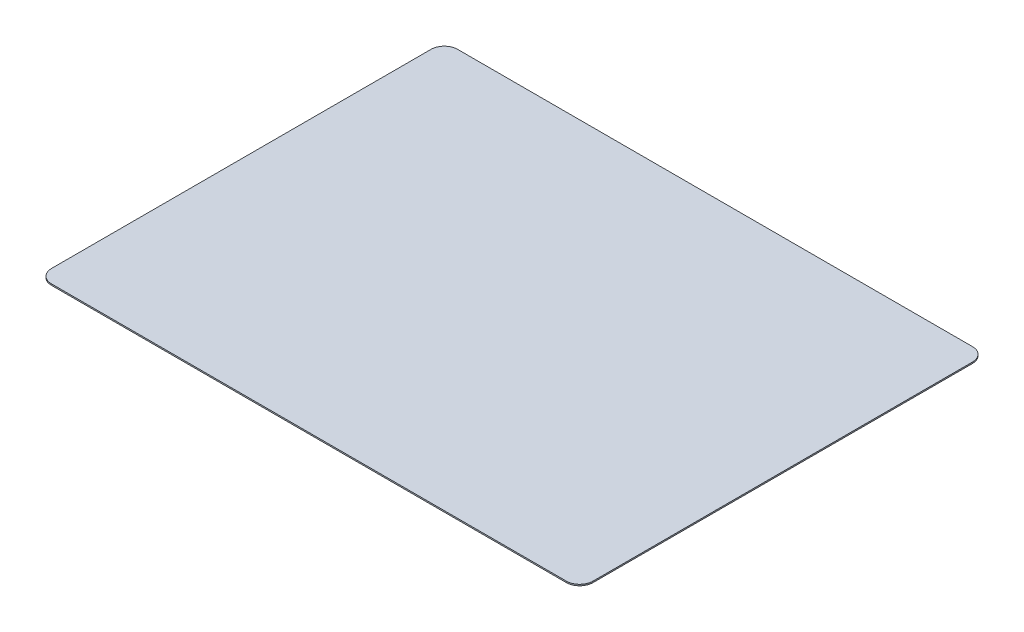
ISO-10303-21;
HEADER;
FILE_DESCRIPTION(('STEP AP214'),'2;1');
FILE_NAME('part.step','',(''),(''),'','','');
FILE_SCHEMA(('AUTOMOTIVE_DESIGN { 1 0 10303 214 1 1 1 1 }'));
ENDSEC;
DATA;
#1=APPLICATION_CONTEXT('core data for automotive mechanical design processes');
#2=APPLICATION_PROTOCOL_DEFINITION('international standard','automotive_design',2000,#1);
#3=PRODUCT_CONTEXT('',#1,'mechanical');
#4=PRODUCT('Part','Part','',(#3));
#5=PRODUCT_RELATED_PRODUCT_CATEGORY('part','',(#4));
#6=PRODUCT_DEFINITION_FORMATION('','',#4);
#7=PRODUCT_DEFINITION_CONTEXT('part definition',#1,'design');
#8=PRODUCT_DEFINITION('design','',#6,#7);
#9=PRODUCT_DEFINITION_SHAPE('','',#8);
#10=(LENGTH_UNIT() NAMED_UNIT(*) SI_UNIT(.MILLI.,.METRE.));
#11=(NAMED_UNIT(*) PLANE_ANGLE_UNIT() SI_UNIT($,.RADIAN.));
#12=(NAMED_UNIT(*) SI_UNIT($,.STERADIAN.) SOLID_ANGLE_UNIT());
#13=UNCERTAINTY_MEASURE_WITH_UNIT(LENGTH_MEASURE(1.E-05),#10,'distance_accuracy_value','');
#14=(GEOMETRIC_REPRESENTATION_CONTEXT(3) GLOBAL_UNCERTAINTY_ASSIGNED_CONTEXT((#13)) GLOBAL_UNIT_ASSIGNED_CONTEXT((#10,
#11,#12)) REPRESENTATION_CONTEXT('',''));
#15=CARTESIAN_POINT('',(0.,0.,0.));
#16=DIRECTION('',(0.,0.,1.));
#17=DIRECTION('',(1.,0.,0.));
#18=AXIS2_PLACEMENT_3D('',#15,#16,#17);
#19=CARTESIAN_POINT('',(203.2,1.,-152.4));
#20=DIRECTION('',(-1.,0.,0.));
#21=DIRECTION('',(0.,0.,1.));
#22=AXIS2_PLACEMENT_3D('',#19,#20,#21);
#23=PLANE('',#22);
#24=DIRECTION('',(0.,0.,-1.));
#25=VECTOR('',#24,1.);
#26=CARTESIAN_POINT('',(203.2,0.,-152.4));
#27=LINE('',#26,#25);
#28=CARTESIAN_POINT('',(203.2,0.,142.4));
#29=VERTEX_POINT('',#28);
#30=CARTESIAN_POINT('',(203.2,0.,-142.4));
#31=VERTEX_POINT('',#30);
#32=EDGE_CURVE('E140',#29,#31,#27,.T.);
#33=ORIENTED_EDGE('',*,*,#32,.T.);
#34=DIRECTION('',(0.,-1.,0.));
#35=VECTOR('',#34,1.);
#36=CARTESIAN_POINT('',(203.2,1.,-142.4));
#37=LINE('',#36,#35);
#38=CARTESIAN_POINT('',(203.2,1.,-142.4));
#39=VERTEX_POINT('',#38);
#40=EDGE_CURVE('E115',#31,#39,#37,.F.);
#41=ORIENTED_EDGE('',*,*,#40,.T.);
#42=DIRECTION('',(0.,0.,-1.));
#43=VECTOR('',#42,1.);
#44=CARTESIAN_POINT('',(203.2,1.,-152.4));
#45=LINE('',#44,#43);
#46=CARTESIAN_POINT('',(203.2,1.,142.4));
#47=VERTEX_POINT('',#46);
#48=EDGE_CURVE('E152',#47,#39,#45,.T.);
#49=ORIENTED_EDGE('',*,*,#48,.F.);
#50=DIRECTION('',(0.,-1.,0.));
#51=VECTOR('',#50,1.);
#52=CARTESIAN_POINT('',(203.2,1.,142.4));
#53=LINE('',#52,#51);
#54=EDGE_CURVE('E121',#47,#29,#53,.T.);
#55=ORIENTED_EDGE('',*,*,#54,.T.);
#56=EDGE_LOOP('',(#33,#41,#49,#55));
#57=FACE_BOUND('',#56,.T.);
#58=ADVANCED_FACE('F43',(#57),#23,.F.);
#59=CARTESIAN_POINT('',(-203.2,1.,-152.4));
#60=DIRECTION('',(0.,0.,1.));
#61=DIRECTION('',(1.,0.,0.));
#62=AXIS2_PLACEMENT_3D('',#59,#60,#61);
#63=PLANE('',#62);
#64=DIRECTION('',(-1.,0.,0.));
#65=VECTOR('',#64,1.);
#66=CARTESIAN_POINT('',(-203.2,1.,-152.4));
#67=LINE('',#66,#65);
#68=CARTESIAN_POINT('',(193.2,1.,-152.4));
#69=VERTEX_POINT('',#68);
#70=CARTESIAN_POINT('',(-193.2,1.,-152.4));
#71=VERTEX_POINT('',#70);
#72=EDGE_CURVE('E131',#69,#71,#67,.T.);
#73=ORIENTED_EDGE('',*,*,#72,.F.);
#74=DIRECTION('',(0.,-1.,0.));
#75=VECTOR('',#74,1.);
#76=CARTESIAN_POINT('',(193.2,1.,-152.4));
#77=LINE('',#76,#75);
#78=CARTESIAN_POINT('',(193.2,0.,-152.4));
#79=VERTEX_POINT('',#78);
#80=EDGE_CURVE('E114',#69,#79,#77,.T.);
#81=ORIENTED_EDGE('',*,*,#80,.T.);
#82=DIRECTION('',(-1.,0.,0.));
#83=VECTOR('',#82,1.);
#84=CARTESIAN_POINT('',(-203.2,0.,-152.4));
#85=LINE('',#84,#83);
#86=CARTESIAN_POINT('',(-193.2,0.,-152.4));
#87=VERTEX_POINT('',#86);
#88=EDGE_CURVE('E128',#79,#87,#85,.T.);
#89=ORIENTED_EDGE('',*,*,#88,.T.);
#90=DIRECTION('',(0.,-1.,0.));
#91=VECTOR('',#90,1.);
#92=CARTESIAN_POINT('',(-193.2,1.,-152.4));
#93=LINE('',#92,#91);
#94=EDGE_CURVE('E134',#87,#71,#93,.F.);
#95=ORIENTED_EDGE('',*,*,#94,.T.);
#96=EDGE_LOOP('',(#73,#81,#89,#95));
#97=FACE_BOUND('',#96,.T.);
#98=ADVANCED_FACE('F127',(#97),#63,.F.);
#99=CARTESIAN_POINT('',(-203.2,1.,-152.4));
#100=DIRECTION('',(1.,0.,0.));
#101=DIRECTION('',(0.,0.,-1.));
#102=AXIS2_PLACEMENT_3D('',#99,#100,#101);
#103=PLANE('',#102);
#104=DIRECTION('',(0.,0.,1.));
#105=VECTOR('',#104,1.);
#106=CARTESIAN_POINT('',(-203.2,1.,-152.4));
#107=LINE('',#106,#105);
#108=CARTESIAN_POINT('',(-203.2,1.,-142.4));
#109=VERTEX_POINT('',#108);
#110=CARTESIAN_POINT('',(-203.2,1.,142.4));
#111=VERTEX_POINT('',#110);
#112=EDGE_CURVE('E188',#109,#111,#107,.T.);
#113=ORIENTED_EDGE('',*,*,#112,.F.);
#114=DIRECTION('',(0.,-1.,0.));
#115=VECTOR('',#114,1.);
#116=CARTESIAN_POINT('',(-203.2,1.,-142.4));
#117=LINE('',#116,#115);
#118=CARTESIAN_POINT('',(-203.2,0.,-142.4));
#119=VERTEX_POINT('',#118);
#120=EDGE_CURVE('E182',#109,#119,#117,.T.);
#121=ORIENTED_EDGE('',*,*,#120,.T.);
#122=DIRECTION('',(0.,0.,1.));
#123=VECTOR('',#122,1.);
#124=CARTESIAN_POINT('',(-203.2,0.,-152.4));
#125=LINE('',#124,#123);
#126=CARTESIAN_POINT('',(-203.2,0.,142.4));
#127=VERTEX_POINT('',#126);
#128=EDGE_CURVE('E139',#119,#127,#125,.T.);
#129=ORIENTED_EDGE('',*,*,#128,.T.);
#130=DIRECTION('',(0.,-1.,0.));
#131=VECTOR('',#130,1.);
#132=CARTESIAN_POINT('',(-203.2,1.,142.4));
#133=LINE('',#132,#131);
#134=EDGE_CURVE('E179',#127,#111,#133,.F.);
#135=ORIENTED_EDGE('',*,*,#134,.T.);
#136=EDGE_LOOP('',(#113,#121,#129,#135));
#137=FACE_BOUND('',#136,.T.);
#138=ADVANCED_FACE('F209',(#137),#103,.F.);
#139=CARTESIAN_POINT('',(-203.2,1.,152.4));
#140=DIRECTION('',(0.,0.,-1.));
#141=DIRECTION('',(-1.,0.,0.));
#142=AXIS2_PLACEMENT_3D('',#139,#140,#141);
#143=PLANE('',#142);
#144=DIRECTION('',(1.,0.,0.));
#145=VECTOR('',#144,1.);
#146=CARTESIAN_POINT('',(-203.2,1.,152.4));
#147=LINE('',#146,#145);
#148=CARTESIAN_POINT('',(-193.2,1.,152.4));
#149=VERTEX_POINT('',#148);
#150=CARTESIAN_POINT('',(193.2,1.,152.4));
#151=VERTEX_POINT('',#150);
#152=EDGE_CURVE('E154',#149,#151,#147,.T.);
#153=ORIENTED_EDGE('',*,*,#152,.F.);
#154=DIRECTION('',(0.,-1.,0.));
#155=VECTOR('',#154,1.);
#156=CARTESIAN_POINT('',(-193.2,1.,152.4));
#157=LINE('',#156,#155);
#158=CARTESIAN_POINT('',(-193.2,0.,152.4));
#159=VERTEX_POINT('',#158);
#160=EDGE_CURVE('E11',#149,#159,#157,.T.);
#161=ORIENTED_EDGE('',*,*,#160,.T.);
#162=DIRECTION('',(1.,0.,0.));
#163=VECTOR('',#162,1.);
#164=CARTESIAN_POINT('',(-203.2,0.,152.4));
#165=LINE('',#164,#163);
#166=CARTESIAN_POINT('',(193.2,0.,152.4));
#167=VERTEX_POINT('',#166);
#168=EDGE_CURVE('E145',#159,#167,#165,.T.);
#169=ORIENTED_EDGE('',*,*,#168,.T.);
#170=DIRECTION('',(0.,-1.,0.));
#171=VECTOR('',#170,1.);
#172=CARTESIAN_POINT('',(193.2,1.,152.4));
#173=LINE('',#172,#171);
#174=EDGE_CURVE('E52',#167,#151,#173,.F.);
#175=ORIENTED_EDGE('',*,*,#174,.T.);
#176=EDGE_LOOP('',(#153,#161,#169,#175));
#177=FACE_BOUND('',#176,.T.);
#178=ADVANCED_FACE('F202',(#177),#143,.F.);
#179=CARTESIAN_POINT('',(0.,1.,0.));
#180=DIRECTION('',(0.,1.,0.));
#181=DIRECTION('',(0.,0.,1.));
#182=AXIS2_PLACEMENT_3D('',#179,#180,#181);
#183=PLANE('',#182);
#184=ORIENTED_EDGE('',*,*,#48,.T.);
#185=CARTESIAN_POINT('',(193.2,1.,-142.4));
#186=DIRECTION('',(0.,1.,0.));
#187=DIRECTION('',(0.,0.,1.));
#188=AXIS2_PLACEMENT_3D('',#185,#186,#187);
#189=CIRCLE('',#188,10.);
#190=EDGE_CURVE('E176',#39,#69,#189,.T.);
#191=ORIENTED_EDGE('',*,*,#190,.T.);
#192=ORIENTED_EDGE('',*,*,#72,.T.);
#193=CARTESIAN_POINT('',(-193.2,1.,-142.4));
#194=DIRECTION('',(0.,1.,0.));
#195=DIRECTION('',(0.,0.,1.));
#196=AXIS2_PLACEMENT_3D('',#193,#194,#195);
#197=CIRCLE('',#196,10.);
#198=EDGE_CURVE('E173',#71,#109,#197,.T.);
#199=ORIENTED_EDGE('',*,*,#198,.T.);
#200=ORIENTED_EDGE('',*,*,#112,.T.);
#201=CARTESIAN_POINT('',(-193.2,1.,142.4));
#202=DIRECTION('',(0.,1.,0.));
#203=DIRECTION('',(0.,0.,1.));
#204=AXIS2_PLACEMENT_3D('',#201,#202,#203);
#205=CIRCLE('',#204,10.);
#206=EDGE_CURVE('E65',#111,#149,#205,.T.);
#207=ORIENTED_EDGE('',*,*,#206,.T.);
#208=ORIENTED_EDGE('',*,*,#152,.T.);
#209=CARTESIAN_POINT('',(193.2,1.,142.4));
#210=DIRECTION('',(0.,1.,0.));
#211=DIRECTION('',(0.,0.,1.));
#212=AXIS2_PLACEMENT_3D('',#209,#210,#211);
#213=CIRCLE('',#212,10.);
#214=EDGE_CURVE('E168',#151,#47,#213,.T.);
#215=ORIENTED_EDGE('',*,*,#214,.T.);
#216=EDGE_LOOP('',(#184,#191,#192,#199,#200,#207,#208,#215));
#217=FACE_BOUND('',#216,.T.);
#218=ADVANCED_FACE('F196',(#217),#183,.T.);
#219=CARTESIAN_POINT('',(0.,0.,0.));
#220=DIRECTION('',(0.,1.,0.));
#221=DIRECTION('',(0.,0.,1.));
#222=AXIS2_PLACEMENT_3D('',#219,#220,#221);
#223=PLANE('',#222);
#224=ORIENTED_EDGE('',*,*,#88,.F.);
#225=CARTESIAN_POINT('',(193.2,0.,-142.4));
#226=DIRECTION('',(0.,1.,0.));
#227=DIRECTION('',(0.,0.,1.));
#228=AXIS2_PLACEMENT_3D('',#225,#226,#227);
#229=CIRCLE('',#228,10.);
#230=EDGE_CURVE('E110',#79,#31,#229,.F.);
#231=ORIENTED_EDGE('',*,*,#230,.T.);
#232=ORIENTED_EDGE('',*,*,#32,.F.);
#233=CARTESIAN_POINT('',(193.2,0.,142.4));
#234=DIRECTION('',(0.,1.,0.));
#235=DIRECTION('',(0.,0.,1.));
#236=AXIS2_PLACEMENT_3D('',#233,#234,#235);
#237=CIRCLE('',#236,10.);
#238=EDGE_CURVE('E133',#29,#167,#237,.F.);
#239=ORIENTED_EDGE('',*,*,#238,.T.);
#240=ORIENTED_EDGE('',*,*,#168,.F.);
#241=CARTESIAN_POINT('',(-193.2,0.,142.4));
#242=DIRECTION('',(0.,1.,0.));
#243=DIRECTION('',(0.,0.,1.));
#244=AXIS2_PLACEMENT_3D('',#241,#242,#243);
#245=CIRCLE('',#244,10.);
#246=EDGE_CURVE('E158',#159,#127,#245,.F.);
#247=ORIENTED_EDGE('',*,*,#246,.T.);
#248=ORIENTED_EDGE('',*,*,#128,.F.);
#249=CARTESIAN_POINT('',(-193.2,0.,-142.4));
#250=DIRECTION('',(0.,1.,0.));
#251=DIRECTION('',(0.,0.,1.));
#252=AXIS2_PLACEMENT_3D('',#249,#250,#251);
#253=CIRCLE('',#252,10.);
#254=EDGE_CURVE('E122',#119,#87,#253,.F.);
#255=ORIENTED_EDGE('',*,*,#254,.T.);
#256=EDGE_LOOP('',(#224,#231,#232,#239,#240,#247,#248,#255));
#257=FACE_BOUND('',#256,.T.);
#258=ADVANCED_FACE('F136',(#257),#223,.F.);
#259=CARTESIAN_POINT('',(193.2,1.,-142.4));
#260=DIRECTION('',(0.,-1.,0.));
#261=DIRECTION('',(0.,0.,-1.));
#262=AXIS2_PLACEMENT_3D('',#259,#260,#261);
#263=CYLINDRICAL_SURFACE('',#262,10.);
#264=ORIENTED_EDGE('',*,*,#190,.F.);
#265=ORIENTED_EDGE('',*,*,#40,.F.);
#266=ORIENTED_EDGE('',*,*,#230,.F.);
#267=ORIENTED_EDGE('',*,*,#80,.F.);
#268=EDGE_LOOP('',(#264,#265,#266,#267));
#269=FACE_BOUND('',#268,.T.);
#270=ADVANCED_FACE('F113',(#269),#263,.T.);
#271=CARTESIAN_POINT('',(-193.2,1.,-142.4));
#272=DIRECTION('',(0.,-1.,0.));
#273=DIRECTION('',(0.,0.,-1.));
#274=AXIS2_PLACEMENT_3D('',#271,#272,#273);
#275=CYLINDRICAL_SURFACE('',#274,10.);
#276=ORIENTED_EDGE('',*,*,#198,.F.);
#277=ORIENTED_EDGE('',*,*,#94,.F.);
#278=ORIENTED_EDGE('',*,*,#254,.F.);
#279=ORIENTED_EDGE('',*,*,#120,.F.);
#280=EDGE_LOOP('',(#276,#277,#278,#279));
#281=FACE_BOUND('',#280,.T.);
#282=ADVANCED_FACE('F213',(#281),#275,.T.);
#283=CARTESIAN_POINT('',(-193.2,1.,142.4));
#284=DIRECTION('',(0.,-1.,0.));
#285=DIRECTION('',(0.,0.,-1.));
#286=AXIS2_PLACEMENT_3D('',#283,#284,#285);
#287=CYLINDRICAL_SURFACE('',#286,10.);
#288=ORIENTED_EDGE('',*,*,#206,.F.);
#289=ORIENTED_EDGE('',*,*,#134,.F.);
#290=ORIENTED_EDGE('',*,*,#246,.F.);
#291=ORIENTED_EDGE('',*,*,#160,.F.);
#292=EDGE_LOOP('',(#288,#289,#290,#291));
#293=FACE_BOUND('',#292,.T.);
#294=ADVANCED_FACE('F205',(#293),#287,.T.);
#295=CARTESIAN_POINT('',(193.2,1.,142.4));
#296=DIRECTION('',(0.,-1.,0.));
#297=DIRECTION('',(0.,0.,-1.));
#298=AXIS2_PLACEMENT_3D('',#295,#296,#297);
#299=CYLINDRICAL_SURFACE('',#298,10.);
#300=ORIENTED_EDGE('',*,*,#214,.F.);
#301=ORIENTED_EDGE('',*,*,#174,.F.);
#302=ORIENTED_EDGE('',*,*,#238,.F.);
#303=ORIENTED_EDGE('',*,*,#54,.F.);
#304=EDGE_LOOP('',(#300,#301,#302,#303));
#305=FACE_BOUND('',#304,.T.);
#306=ADVANCED_FACE('F45',(#305),#299,.T.);
#307=CLOSED_SHELL('',(#58,#98,#138,#178,#218,#258,#270,#282,#294,#306));
#308=MANIFOLD_SOLID_BREP('B2',#307);
#309=ADVANCED_BREP_SHAPE_REPRESENTATION('',(#18,#308),#14);
#310=SHAPE_DEFINITION_REPRESENTATION(#9,#309);
ENDSEC;
END-ISO-10303-21;
